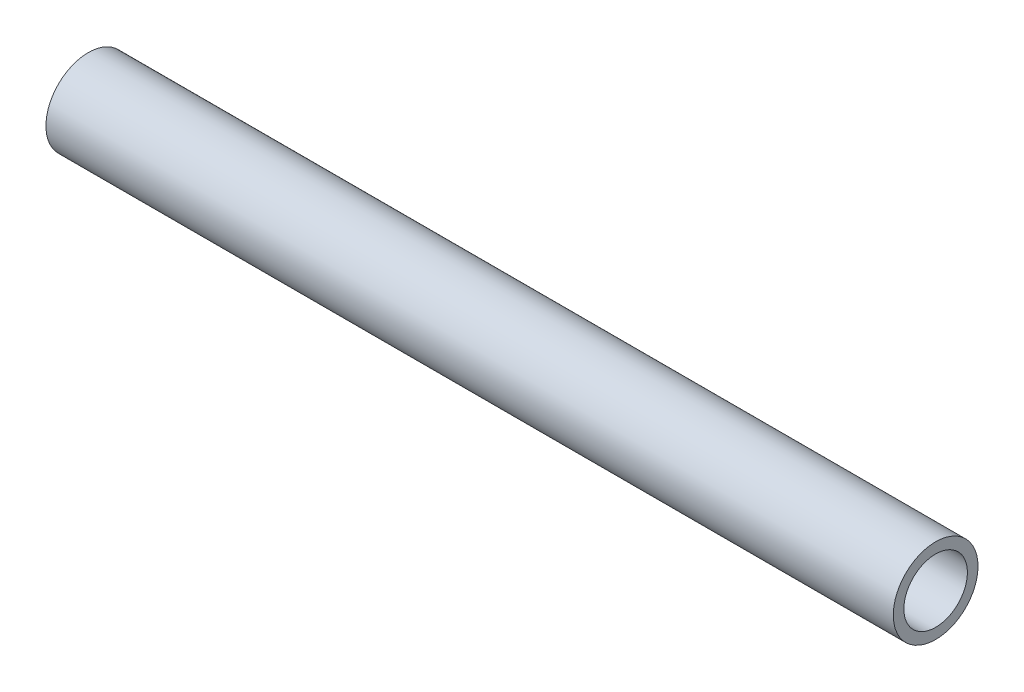
ISO-10303-21;
HEADER;
FILE_DESCRIPTION(('STEP AP214'),'2;1');
FILE_NAME('part.step','',(''),(''),'','','');
FILE_SCHEMA(('AUTOMOTIVE_DESIGN { 1 0 10303 214 1 1 1 1 }'));
ENDSEC;
DATA;
#1=APPLICATION_CONTEXT('core data for automotive mechanical design processes');
#2=APPLICATION_PROTOCOL_DEFINITION('international standard','automotive_design',2000,#1);
#3=PRODUCT_CONTEXT('',#1,'mechanical');
#4=PRODUCT('Part','Part','',(#3));
#5=PRODUCT_RELATED_PRODUCT_CATEGORY('part','',(#4));
#6=PRODUCT_DEFINITION_FORMATION('','',#4);
#7=PRODUCT_DEFINITION_CONTEXT('part definition',#1,'design');
#8=PRODUCT_DEFINITION('design','',#6,#7);
#9=PRODUCT_DEFINITION_SHAPE('','',#8);
#10=(LENGTH_UNIT() NAMED_UNIT(*) SI_UNIT(.MILLI.,.METRE.));
#11=(NAMED_UNIT(*) PLANE_ANGLE_UNIT() SI_UNIT($,.RADIAN.));
#12=(NAMED_UNIT(*) SI_UNIT($,.STERADIAN.) SOLID_ANGLE_UNIT());
#13=UNCERTAINTY_MEASURE_WITH_UNIT(LENGTH_MEASURE(1.E-05),#10,'distance_accuracy_value','');
#14=(GEOMETRIC_REPRESENTATION_CONTEXT(3) GLOBAL_UNCERTAINTY_ASSIGNED_CONTEXT((#13)) GLOBAL_UNIT_ASSIGNED_CONTEXT((#10,
#11,#12)) REPRESENTATION_CONTEXT('',''));
#15=CARTESIAN_POINT('',(0.,0.,0.));
#16=DIRECTION('',(0.,0.,1.));
#17=DIRECTION('',(1.,0.,0.));
#18=AXIS2_PLACEMENT_3D('',#15,#16,#17);
#19=CARTESIAN_POINT('',(127.,0.,0.));
#20=DIRECTION('',(1.,0.,0.));
#21=DIRECTION('',(0.,0.,-1.));
#22=AXIS2_PLACEMENT_3D('',#19,#20,#21);
#23=PLANE('',#22);
#24=CARTESIAN_POINT('',(127.,0.,0.));
#25=DIRECTION('',(1.,0.,0.));
#26=DIRECTION('',(0.,0.,-1.));
#27=AXIS2_PLACEMENT_3D('',#24,#25,#26);
#28=CIRCLE('',#27,12.7);
#29=CARTESIAN_POINT('',(127.,0.,-12.7));
#30=VERTEX_POINT('',#29);
#31=EDGE_CURVE('E10',#30,#30,#28,.T.);
#32=ORIENTED_EDGE('',*,*,#31,.T.);
#33=EDGE_LOOP('',(#32));
#34=FACE_BOUND('',#33,.T.);
#35=CARTESIAN_POINT('',(127.,0.,0.));
#36=DIRECTION('',(1.,0.,0.));
#37=DIRECTION('',(0.,0.,-1.));
#38=AXIS2_PLACEMENT_3D('',#35,#36,#37);
#39=CIRCLE('',#38,9.525);
#40=CARTESIAN_POINT('',(127.,0.,-9.525));
#41=VERTEX_POINT('',#40);
#42=EDGE_CURVE('E52',#41,#41,#39,.T.);
#43=ORIENTED_EDGE('',*,*,#42,.F.);
#44=EDGE_LOOP('',(#43));
#45=FACE_BOUND('',#44,.T.);
#46=ADVANCED_FACE('F39',(#34,#45),#23,.T.);
#47=CARTESIAN_POINT('',(-127.,0.,0.));
#48=DIRECTION('',(1.,0.,0.));
#49=DIRECTION('',(0.,0.,-1.));
#50=AXIS2_PLACEMENT_3D('',#47,#48,#49);
#51=PLANE('',#50);
#52=CARTESIAN_POINT('',(-127.,0.,0.));
#53=DIRECTION('',(1.,0.,0.));
#54=DIRECTION('',(0.,0.,-1.));
#55=AXIS2_PLACEMENT_3D('',#52,#53,#54);
#56=CIRCLE('',#55,12.7);
#57=CARTESIAN_POINT('',(-127.,0.,-12.7));
#58=VERTEX_POINT('',#57);
#59=EDGE_CURVE('E43',#58,#58,#56,.T.);
#60=ORIENTED_EDGE('',*,*,#59,.F.);
#61=EDGE_LOOP('',(#60));
#62=FACE_BOUND('',#61,.T.);
#63=CARTESIAN_POINT('',(-127.,0.,0.));
#64=DIRECTION('',(1.,0.,0.));
#65=DIRECTION('',(0.,0.,-1.));
#66=AXIS2_PLACEMENT_3D('',#63,#64,#65);
#67=CIRCLE('',#66,9.525);
#68=CARTESIAN_POINT('',(-127.,0.,-9.525));
#69=VERTEX_POINT('',#68);
#70=EDGE_CURVE('E54',#69,#69,#67,.T.);
#71=ORIENTED_EDGE('',*,*,#70,.T.);
#72=EDGE_LOOP('',(#71));
#73=FACE_BOUND('',#72,.T.);
#74=ADVANCED_FACE('F66',(#62,#73),#51,.F.);
#75=CARTESIAN_POINT('',(127.,0.,0.));
#76=DIRECTION('',(-1.,0.,0.));
#77=DIRECTION('',(0.,0.,1.));
#78=AXIS2_PLACEMENT_3D('',#75,#76,#77);
#79=CYLINDRICAL_SURFACE('',#78,12.7);
#80=ORIENTED_EDGE('',*,*,#31,.F.);
#81=EDGE_LOOP('',(#80));
#82=FACE_BOUND('',#81,.T.);
#83=ORIENTED_EDGE('',*,*,#59,.T.);
#84=EDGE_LOOP('',(#83));
#85=FACE_BOUND('',#84,.T.);
#86=ADVANCED_FACE('F41',(#82,#85),#79,.T.);
#87=CARTESIAN_POINT('',(127.,0.,0.));
#88=DIRECTION('',(-1.,0.,0.));
#89=DIRECTION('',(0.,0.,1.));
#90=AXIS2_PLACEMENT_3D('',#87,#88,#89);
#91=CYLINDRICAL_SURFACE('',#90,9.525);
#92=ORIENTED_EDGE('',*,*,#42,.T.);
#93=EDGE_LOOP('',(#92));
#94=FACE_BOUND('',#93,.T.);
#95=ORIENTED_EDGE('',*,*,#70,.F.);
#96=EDGE_LOOP('',(#95));
#97=FACE_BOUND('',#96,.T.);
#98=ADVANCED_FACE('F62',(#94,#97),#91,.F.);
#99=CLOSED_SHELL('',(#46,#74,#86,#98));
#100=MANIFOLD_SOLID_BREP('B2',#99);
#101=ADVANCED_BREP_SHAPE_REPRESENTATION('',(#18,#100),#14);
#102=SHAPE_DEFINITION_REPRESENTATION(#9,#101);
ENDSEC;
END-ISO-10303-21;
